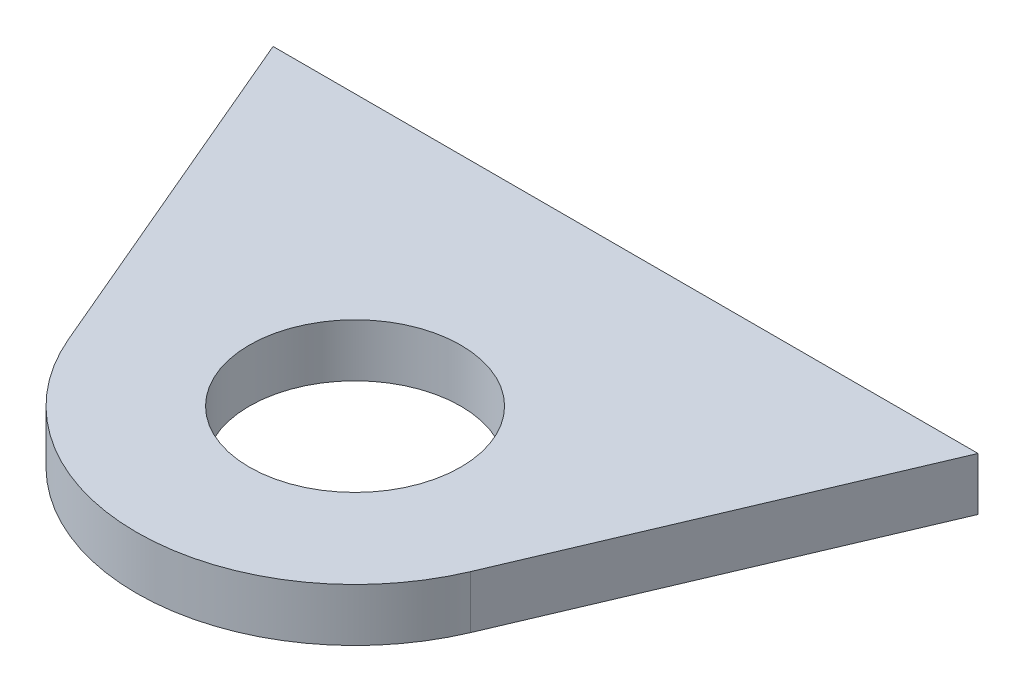
ISO-10303-21;
HEADER;
FILE_DESCRIPTION(('STEP AP214'),'2;1');
FILE_NAME('part.step','',(''),(''),'','','');
FILE_SCHEMA(('AUTOMOTIVE_DESIGN { 1 0 10303 214 1 1 1 1 }'));
ENDSEC;
DATA;
#1=APPLICATION_CONTEXT('core data for automotive mechanical design processes');
#2=APPLICATION_PROTOCOL_DEFINITION('international standard','automotive_design',2000,#1);
#3=PRODUCT_CONTEXT('',#1,'mechanical');
#4=PRODUCT('Part','Part','',(#3));
#5=PRODUCT_RELATED_PRODUCT_CATEGORY('part','',(#4));
#6=PRODUCT_DEFINITION_FORMATION('','',#4);
#7=PRODUCT_DEFINITION_CONTEXT('part definition',#1,'design');
#8=PRODUCT_DEFINITION('design','',#6,#7);
#9=PRODUCT_DEFINITION_SHAPE('','',#8);
#10=(LENGTH_UNIT() NAMED_UNIT(*) SI_UNIT(.MILLI.,.METRE.));
#11=(NAMED_UNIT(*) PLANE_ANGLE_UNIT() SI_UNIT($,.RADIAN.));
#12=(NAMED_UNIT(*) SI_UNIT($,.STERADIAN.) SOLID_ANGLE_UNIT());
#13=UNCERTAINTY_MEASURE_WITH_UNIT(LENGTH_MEASURE(1.E-05),#10,'distance_accuracy_value','');
#14=(GEOMETRIC_REPRESENTATION_CONTEXT(3) GLOBAL_UNCERTAINTY_ASSIGNED_CONTEXT((#13)) GLOBAL_UNIT_ASSIGNED_CONTEXT((#10,
#11,#12)) REPRESENTATION_CONTEXT('',''));
#15=CARTESIAN_POINT('',(0.,0.,0.));
#16=DIRECTION('',(0.,0.,1.));
#17=DIRECTION('',(1.,0.,0.));
#18=AXIS2_PLACEMENT_3D('',#15,#16,#17);
#19=CARTESIAN_POINT('',(0.,3.,0.));
#20=DIRECTION('',(0.,1.,0.));
#21=DIRECTION('',(0.,0.,1.));
#22=AXIS2_PLACEMENT_3D('',#19,#20,#21);
#23=PLANE('',#22);
#24=CARTESIAN_POINT('',(0.,3.,0.));
#25=DIRECTION('',(0.,1.,0.));
#26=DIRECTION('',(0.,0.,1.));
#27=AXIS2_PLACEMENT_3D('',#24,#25,#26);
#28=CIRCLE('',#27,12.4);
#29=CARTESIAN_POINT('',(-11.4113644124599,3.,4.85188234049879));
#30=VERTEX_POINT('',#29);
#31=CARTESIAN_POINT('',(11.4113644124599,3.,4.85188234049879));
#32=VERTEX_POINT('',#31);
#33=EDGE_CURVE('E98',#30,#32,#28,.T.);
#34=ORIENTED_EDGE('',*,*,#33,.T.);
#35=DIRECTION('',(0.391280833911193,0.,-0.920271323585474));
#36=VECTOR('',#35,1.);
#37=CARTESIAN_POINT('',(11.4113644124599,3.,4.85188234049879));
#38=LINE('',#37,#36);
#39=CARTESIAN_POINT('',(20.,3.,-15.3481232691109));
#40=VERTEX_POINT('',#39);
#41=EDGE_CURVE('E93',#32,#40,#38,.T.);
#42=ORIENTED_EDGE('',*,*,#41,.T.);
#43=DIRECTION('',(-1.,0.,0.));
#44=VECTOR('',#43,1.);
#45=CARTESIAN_POINT('',(-20.,3.,-15.3481232691109));
#46=LINE('',#45,#44);
#47=CARTESIAN_POINT('',(-20.,3.,-15.3481232691109));
#48=VERTEX_POINT('',#47);
#49=EDGE_CURVE('E96',#40,#48,#46,.T.);
#50=ORIENTED_EDGE('',*,*,#49,.T.);
#51=DIRECTION('',(0.391280833911193,0.,0.920271323585474));
#52=VECTOR('',#51,1.);
#53=CARTESIAN_POINT('',(-11.4113644124599,3.,4.85188234049879));
#54=LINE('',#53,#52);
#55=EDGE_CURVE('E63',#48,#30,#54,.T.);
#56=ORIENTED_EDGE('',*,*,#55,.T.);
#57=EDGE_LOOP('',(#34,#42,#50,#56));
#58=FACE_BOUND('',#57,.T.);
#59=CARTESIAN_POINT('',(0.,3.,0.));
#60=DIRECTION('',(0.,1.,0.));
#61=DIRECTION('',(0.,0.,1.));
#62=AXIS2_PLACEMENT_3D('',#59,#60,#61);
#63=CIRCLE('',#62,6.);
#64=CARTESIAN_POINT('',(0.,3.,6.));
#65=VERTEX_POINT('',#64);
#66=EDGE_CURVE('E118',#65,#65,#63,.T.);
#67=ORIENTED_EDGE('',*,*,#66,.F.);
#68=EDGE_LOOP('',(#67));
#69=FACE_BOUND('',#68,.T.);
#70=ADVANCED_FACE('F45',(#58,#69),#23,.T.);
#71=CARTESIAN_POINT('',(0.,0.,0.));
#72=DIRECTION('',(0.,1.,0.));
#73=DIRECTION('',(0.,0.,1.));
#74=AXIS2_PLACEMENT_3D('',#71,#72,#73);
#75=PLANE('',#74);
#76=CARTESIAN_POINT('',(0.,0.,0.));
#77=DIRECTION('',(0.,1.,0.));
#78=DIRECTION('',(0.,0.,1.));
#79=AXIS2_PLACEMENT_3D('',#76,#77,#78);
#80=CIRCLE('',#79,12.4);
#81=CARTESIAN_POINT('',(-11.4113644124599,0.,4.85188234049879));
#82=VERTEX_POINT('',#81);
#83=CARTESIAN_POINT('',(11.4113644124599,0.,4.85188234049879));
#84=VERTEX_POINT('',#83);
#85=EDGE_CURVE('E114',#82,#84,#80,.T.);
#86=ORIENTED_EDGE('',*,*,#85,.F.);
#87=DIRECTION('',(0.391280833911193,0.,0.920271323585474));
#88=VECTOR('',#87,1.);
#89=CARTESIAN_POINT('',(-11.4113644124599,0.,4.85188234049879));
#90=LINE('',#89,#88);
#91=CARTESIAN_POINT('',(-20.,0.,-15.3481232691109));
#92=VERTEX_POINT('',#91);
#93=EDGE_CURVE('E86',#92,#82,#90,.T.);
#94=ORIENTED_EDGE('',*,*,#93,.F.);
#95=DIRECTION('',(-1.,0.,0.));
#96=VECTOR('',#95,1.);
#97=CARTESIAN_POINT('',(-20.,0.,-15.3481232691109));
#98=LINE('',#97,#96);
#99=CARTESIAN_POINT('',(20.,0.,-15.3481232691109));
#100=VERTEX_POINT('',#99);
#101=EDGE_CURVE('E80',#100,#92,#98,.T.);
#102=ORIENTED_EDGE('',*,*,#101,.F.);
#103=DIRECTION('',(0.391280833911193,0.,-0.920271323585474));
#104=VECTOR('',#103,1.);
#105=CARTESIAN_POINT('',(11.4113644124599,0.,4.85188234049879));
#106=LINE('',#105,#104);
#107=EDGE_CURVE('E103',#84,#100,#106,.T.);
#108=ORIENTED_EDGE('',*,*,#107,.F.);
#109=EDGE_LOOP('',(#86,#94,#102,#108));
#110=FACE_BOUND('',#109,.T.);
#111=CARTESIAN_POINT('',(0.,0.,0.));
#112=DIRECTION('',(0.,1.,0.));
#113=DIRECTION('',(0.,0.,1.));
#114=AXIS2_PLACEMENT_3D('',#111,#112,#113);
#115=CIRCLE('',#114,6.);
#116=CARTESIAN_POINT('',(0.,0.,6.));
#117=VERTEX_POINT('',#116);
#118=EDGE_CURVE('E136',#117,#117,#115,.T.);
#119=ORIENTED_EDGE('',*,*,#118,.T.);
#120=EDGE_LOOP('',(#119));
#121=FACE_BOUND('',#120,.T.);
#122=ADVANCED_FACE('F131',(#110,#121),#75,.F.);
#123=CARTESIAN_POINT('',(0.,3.,0.));
#124=DIRECTION('',(0.,-1.,0.));
#125=DIRECTION('',(0.,0.,-1.));
#126=AXIS2_PLACEMENT_3D('',#123,#124,#125);
#127=CYLINDRICAL_SURFACE('',#126,12.4);
#128=ORIENTED_EDGE('',*,*,#85,.T.);
#129=DIRECTION('',(0.,-1.,0.));
#130=VECTOR('',#129,1.);
#131=CARTESIAN_POINT('',(11.4113644124599,3.,4.85188234049879));
#132=LINE('',#131,#130);
#133=EDGE_CURVE('E11',#32,#84,#132,.T.);
#134=ORIENTED_EDGE('',*,*,#133,.F.);
#135=ORIENTED_EDGE('',*,*,#33,.F.);
#136=DIRECTION('',(0.,-1.,0.));
#137=VECTOR('',#136,1.);
#138=CARTESIAN_POINT('',(-11.4113644124599,3.,4.85188234049879));
#139=LINE('',#138,#137);
#140=EDGE_CURVE('E110',#30,#82,#139,.T.);
#141=ORIENTED_EDGE('',*,*,#140,.T.);
#142=EDGE_LOOP('',(#128,#134,#135,#141));
#143=FACE_BOUND('',#142,.T.);
#144=ADVANCED_FACE('F47',(#143),#127,.T.);
#145=CARTESIAN_POINT('',(11.4113644124599,3.,4.85188234049879));
#146=DIRECTION('',(-0.920271323585474,0.,-0.391280833911193));
#147=DIRECTION('',(-0.391280833911193,0.,0.920271323585475));
#148=AXIS2_PLACEMENT_3D('',#145,#146,#147);
#149=PLANE('',#148);
#150=ORIENTED_EDGE('',*,*,#107,.T.);
#151=DIRECTION('',(0.,-1.,0.));
#152=VECTOR('',#151,1.);
#153=CARTESIAN_POINT('',(20.,3.,-15.3481232691109));
#154=LINE('',#153,#152);
#155=EDGE_CURVE('E55',#40,#100,#154,.T.);
#156=ORIENTED_EDGE('',*,*,#155,.F.);
#157=ORIENTED_EDGE('',*,*,#41,.F.);
#158=ORIENTED_EDGE('',*,*,#133,.T.);
#159=EDGE_LOOP('',(#150,#156,#157,#158));
#160=FACE_BOUND('',#159,.T.);
#161=ADVANCED_FACE('F102',(#160),#149,.F.);
#162=CARTESIAN_POINT('',(-20.,3.,-15.3481232691109));
#163=DIRECTION('',(0.,0.,1.));
#164=DIRECTION('',(1.,0.,0.));
#165=AXIS2_PLACEMENT_3D('',#162,#163,#164);
#166=PLANE('',#165);
#167=ORIENTED_EDGE('',*,*,#101,.T.);
#168=DIRECTION('',(0.,-1.,0.));
#169=VECTOR('',#168,1.);
#170=CARTESIAN_POINT('',(-20.,3.,-15.3481232691109));
#171=LINE('',#170,#169);
#172=EDGE_CURVE('E105',#48,#92,#171,.T.);
#173=ORIENTED_EDGE('',*,*,#172,.F.);
#174=ORIENTED_EDGE('',*,*,#49,.F.);
#175=ORIENTED_EDGE('',*,*,#155,.T.);
#176=EDGE_LOOP('',(#167,#173,#174,#175));
#177=FACE_BOUND('',#176,.T.);
#178=ADVANCED_FACE('F106',(#177),#166,.F.);
#179=CARTESIAN_POINT('',(-11.4113644124599,3.,4.85188234049879));
#180=DIRECTION('',(0.920271323585474,0.,-0.391280833911193));
#181=DIRECTION('',(-0.391280833911193,0.,-0.920271323585475));
#182=AXIS2_PLACEMENT_3D('',#179,#180,#181);
#183=PLANE('',#182);
#184=ORIENTED_EDGE('',*,*,#93,.T.);
#185=ORIENTED_EDGE('',*,*,#140,.F.);
#186=ORIENTED_EDGE('',*,*,#55,.F.);
#187=ORIENTED_EDGE('',*,*,#172,.T.);
#188=EDGE_LOOP('',(#184,#185,#186,#187));
#189=FACE_BOUND('',#188,.T.);
#190=ADVANCED_FACE('F128',(#189),#183,.F.);
#191=CARTESIAN_POINT('',(0.,3.,0.));
#192=DIRECTION('',(0.,-1.,0.));
#193=DIRECTION('',(0.,0.,-1.));
#194=AXIS2_PLACEMENT_3D('',#191,#192,#193);
#195=CYLINDRICAL_SURFACE('',#194,6.);
#196=ORIENTED_EDGE('',*,*,#66,.T.);
#197=EDGE_LOOP('',(#196));
#198=FACE_BOUND('',#197,.T.);
#199=ORIENTED_EDGE('',*,*,#118,.F.);
#200=EDGE_LOOP('',(#199));
#201=FACE_BOUND('',#200,.T.);
#202=ADVANCED_FACE('F144',(#198,#201),#195,.F.);
#203=CLOSED_SHELL('',(#70,#122,#144,#161,#178,#190,#202));
#204=MANIFOLD_SOLID_BREP('B2',#203);
#205=ADVANCED_BREP_SHAPE_REPRESENTATION('',(#18,#204),#14);
#206=SHAPE_DEFINITION_REPRESENTATION(#9,#205);
ENDSEC;
END-ISO-10303-21;
